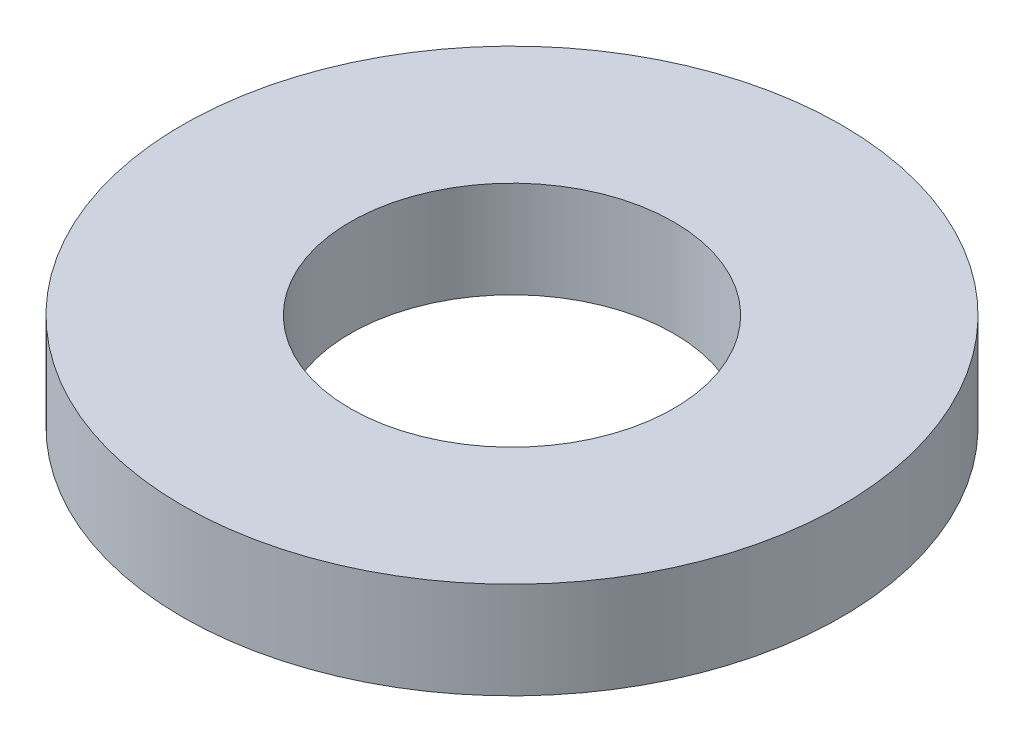
ISO-10303-21;
HEADER;
FILE_DESCRIPTION(('STEP AP214'),'2;1');
FILE_NAME('part.step','',(''),(''),'','','');
FILE_SCHEMA(('AUTOMOTIVE_DESIGN { 1 0 10303 214 1 1 1 1 }'));
ENDSEC;
DATA;
#1=APPLICATION_CONTEXT('core data for automotive mechanical design processes');
#2=APPLICATION_PROTOCOL_DEFINITION('international standard','automotive_design',2000,#1);
#3=PRODUCT_CONTEXT('',#1,'mechanical');
#4=PRODUCT('Part','Part','',(#3));
#5=PRODUCT_RELATED_PRODUCT_CATEGORY('part','',(#4));
#6=PRODUCT_DEFINITION_FORMATION('','',#4);
#7=PRODUCT_DEFINITION_CONTEXT('part definition',#1,'design');
#8=PRODUCT_DEFINITION('design','',#6,#7);
#9=PRODUCT_DEFINITION_SHAPE('','',#8);
#10=(LENGTH_UNIT() NAMED_UNIT(*) SI_UNIT(.MILLI.,.METRE.));
#11=(NAMED_UNIT(*) PLANE_ANGLE_UNIT() SI_UNIT($,.RADIAN.));
#12=(NAMED_UNIT(*) SI_UNIT($,.STERADIAN.) SOLID_ANGLE_UNIT());
#13=UNCERTAINTY_MEASURE_WITH_UNIT(LENGTH_MEASURE(1.E-05),#10,'distance_accuracy_value','');
#14=(GEOMETRIC_REPRESENTATION_CONTEXT(3) GLOBAL_UNCERTAINTY_ASSIGNED_CONTEXT((#13)) GLOBAL_UNIT_ASSIGNED_CONTEXT((#10,
#11,#12)) REPRESENTATION_CONTEXT('',''));
#15=CARTESIAN_POINT('',(0.,0.,0.));
#16=DIRECTION('',(0.,0.,1.));
#17=DIRECTION('',(1.,0.,0.));
#18=AXIS2_PLACEMENT_3D('',#15,#16,#17);
#19=CARTESIAN_POINT('',(0.,1.397,0.));
#20=DIRECTION('',(0.,-1.,0.));
#21=DIRECTION('',(0.,0.,-1.));
#22=AXIS2_PLACEMENT_3D('',#19,#20,#21);
#23=CYLINDRICAL_SURFACE('',#22,4.7625);
#24=CARTESIAN_POINT('',(0.,1.397,0.));
#25=DIRECTION('',(0.,1.,0.));
#26=DIRECTION('',(0.,0.,1.));
#27=AXIS2_PLACEMENT_3D('',#24,#25,#26);
#28=CIRCLE('',#27,4.7625);
#29=CARTESIAN_POINT('',(0.,1.397,4.7625));
#30=VERTEX_POINT('',#29);
#31=EDGE_CURVE('E10',#30,#30,#28,.T.);
#32=ORIENTED_EDGE('',*,*,#31,.F.);
#33=EDGE_LOOP('',(#32));
#34=FACE_BOUND('',#33,.T.);
#35=CARTESIAN_POINT('',(0.,0.,0.));
#36=DIRECTION('',(0.,1.,0.));
#37=DIRECTION('',(0.,0.,1.));
#38=AXIS2_PLACEMENT_3D('',#35,#36,#37);
#39=CIRCLE('',#38,4.7625);
#40=CARTESIAN_POINT('',(0.,0.,4.7625));
#41=VERTEX_POINT('',#40);
#42=EDGE_CURVE('E32',#41,#41,#39,.T.);
#43=ORIENTED_EDGE('',*,*,#42,.T.);
#44=EDGE_LOOP('',(#43));
#45=FACE_BOUND('',#44,.T.);
#46=ADVANCED_FACE('F29',(#34,#45),#23,.T.);
#47=CARTESIAN_POINT('',(0.,1.397,0.));
#48=DIRECTION('',(0.,1.,0.));
#49=DIRECTION('',(0.,0.,1.));
#50=AXIS2_PLACEMENT_3D('',#47,#48,#49);
#51=PLANE('',#50);
#52=CARTESIAN_POINT('',(0.,1.397,0.));
#53=DIRECTION('',(0.,1.,0.));
#54=DIRECTION('',(0.,0.,1.));
#55=AXIS2_PLACEMENT_3D('',#52,#53,#54);
#56=CIRCLE('',#55,2.3368);
#57=CARTESIAN_POINT('',(0.,1.397,2.3368));
#58=VERTEX_POINT('',#57);
#59=EDGE_CURVE('E41',#58,#58,#56,.T.);
#60=ORIENTED_EDGE('',*,*,#59,.F.);
#61=EDGE_LOOP('',(#60));
#62=FACE_BOUND('',#61,.T.);
#63=ORIENTED_EDGE('',*,*,#31,.T.);
#64=EDGE_LOOP('',(#63));
#65=FACE_BOUND('',#64,.T.);
#66=ADVANCED_FACE('F56',(#62,#65),#51,.T.);
#67=CARTESIAN_POINT('',(0.,0.,0.));
#68=DIRECTION('',(0.,1.,0.));
#69=DIRECTION('',(0.,0.,1.));
#70=AXIS2_PLACEMENT_3D('',#67,#68,#69);
#71=PLANE('',#70);
#72=CARTESIAN_POINT('',(0.,0.,0.));
#73=DIRECTION('',(0.,1.,0.));
#74=DIRECTION('',(0.,0.,1.));
#75=AXIS2_PLACEMENT_3D('',#72,#73,#74);
#76=CIRCLE('',#75,2.3368);
#77=CARTESIAN_POINT('',(0.,0.,2.3368));
#78=VERTEX_POINT('',#77);
#79=EDGE_CURVE('E39',#78,#78,#76,.T.);
#80=ORIENTED_EDGE('',*,*,#79,.T.);
#81=EDGE_LOOP('',(#80));
#82=FACE_BOUND('',#81,.T.);
#83=ORIENTED_EDGE('',*,*,#42,.F.);
#84=EDGE_LOOP('',(#83));
#85=FACE_BOUND('',#84,.T.);
#86=ADVANCED_FACE('F47',(#82,#85),#71,.F.);
#87=CARTESIAN_POINT('',(0.,0.,0.));
#88=DIRECTION('',(0.,1.,0.));
#89=DIRECTION('',(0.,0.,1.));
#90=AXIS2_PLACEMENT_3D('',#87,#88,#89);
#91=CYLINDRICAL_SURFACE('',#90,2.3368);
#92=ORIENTED_EDGE('',*,*,#79,.F.);
#93=EDGE_LOOP('',(#92));
#94=FACE_BOUND('',#93,.T.);
#95=ORIENTED_EDGE('',*,*,#59,.T.);
#96=EDGE_LOOP('',(#95));
#97=FACE_BOUND('',#96,.T.);
#98=ADVANCED_FACE('F50',(#94,#97),#91,.F.);
#99=CLOSED_SHELL('',(#46,#66,#86,#98));
#100=MANIFOLD_SOLID_BREP('B2',#99);
#101=ADVANCED_BREP_SHAPE_REPRESENTATION('',(#18,#100),#14);
#102=SHAPE_DEFINITION_REPRESENTATION(#9,#101);
ENDSEC;
END-ISO-10303-21;
